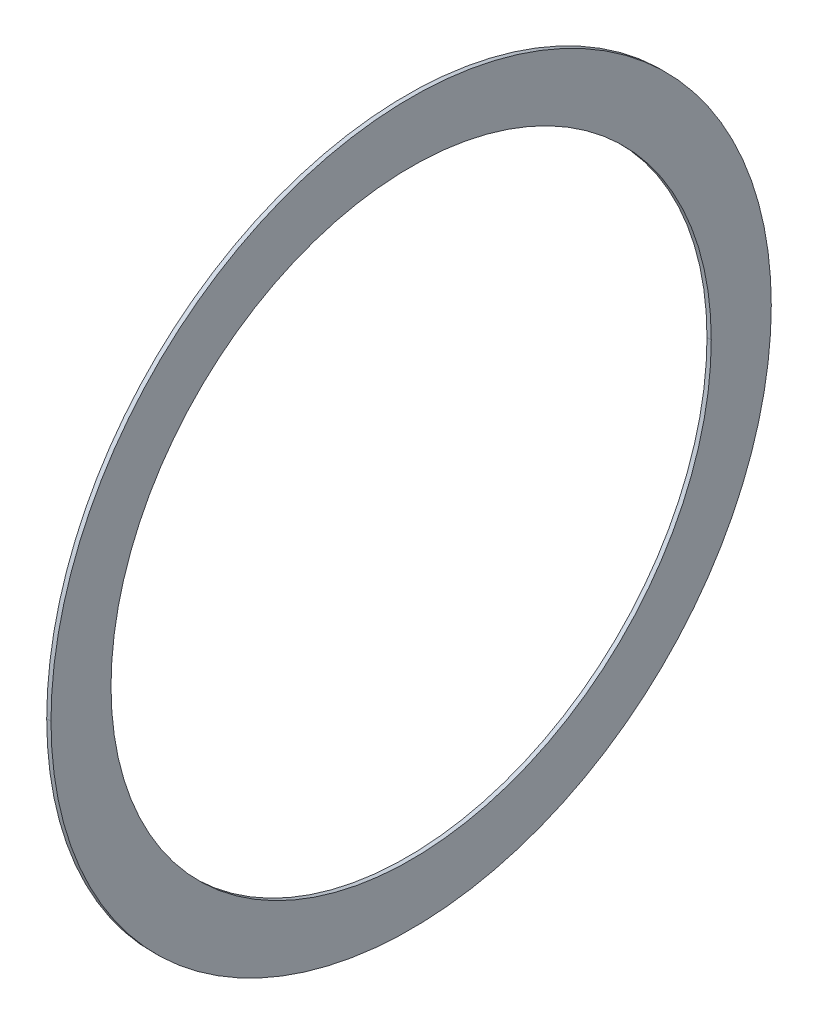
ISO-10303-21;
HEADER;
FILE_DESCRIPTION(('STEP AP214'),'2;1');
FILE_NAME('part.step','',(''),(''),'','','');
FILE_SCHEMA(('AUTOMOTIVE_DESIGN { 1 0 10303 214 1 1 1 1 }'));
ENDSEC;
DATA;
#1=APPLICATION_CONTEXT('core data for automotive mechanical design processes');
#2=APPLICATION_PROTOCOL_DEFINITION('international standard','automotive_design',2000,#1);
#3=PRODUCT_CONTEXT('',#1,'mechanical');
#4=PRODUCT('Part','Part','',(#3));
#5=PRODUCT_RELATED_PRODUCT_CATEGORY('part','',(#4));
#6=PRODUCT_DEFINITION_FORMATION('','',#4);
#7=PRODUCT_DEFINITION_CONTEXT('part definition',#1,'design');
#8=PRODUCT_DEFINITION('design','',#6,#7);
#9=PRODUCT_DEFINITION_SHAPE('','',#8);
#10=(LENGTH_UNIT() NAMED_UNIT(*) SI_UNIT(.MILLI.,.METRE.));
#11=(NAMED_UNIT(*) PLANE_ANGLE_UNIT() SI_UNIT($,.RADIAN.));
#12=(NAMED_UNIT(*) SI_UNIT($,.STERADIAN.) SOLID_ANGLE_UNIT());
#13=UNCERTAINTY_MEASURE_WITH_UNIT(LENGTH_MEASURE(1.E-05),#10,'distance_accuracy_value','');
#14=(GEOMETRIC_REPRESENTATION_CONTEXT(3) GLOBAL_UNCERTAINTY_ASSIGNED_CONTEXT((#13)) GLOBAL_UNIT_ASSIGNED_CONTEXT((#10,
#11,#12)) REPRESENTATION_CONTEXT('',''));
#15=CARTESIAN_POINT('',(0.,0.,0.));
#16=DIRECTION('',(0.,0.,1.));
#17=DIRECTION('',(1.,0.,0.));
#18=AXIS2_PLACEMENT_3D('',#15,#16,#17);
#19=CARTESIAN_POINT('',(0.,46.5,0.));
#20=DIRECTION('',(-1.,0.,0.));
#21=DIRECTION('',(0.,0.,1.));
#22=AXIS2_PLACEMENT_3D('',#19,#20,#21);
#23=PLANE('',#22);
#24=CARTESIAN_POINT('',(0.,0.,0.));
#25=DIRECTION('',(1.,0.,0.));
#26=DIRECTION('',(0.,0.,-1.));
#27=AXIS2_PLACEMENT_3D('',#24,#25,#26);
#28=CIRCLE('',#27,38.75);
#29=CARTESIAN_POINT('',(0.,0.,-38.75));
#30=VERTEX_POINT('',#29);
#31=CARTESIAN_POINT('',(0.,0.,38.75));
#32=VERTEX_POINT('',#31);
#33=EDGE_CURVE('E11',#30,#32,#28,.T.);
#34=ORIENTED_EDGE('',*,*,#33,.T.);
#35=CARTESIAN_POINT('',(0.,0.,0.));
#36=DIRECTION('',(1.,0.,0.));
#37=DIRECTION('',(0.,0.,-1.));
#38=AXIS2_PLACEMENT_3D('',#35,#36,#37);
#39=CIRCLE('',#38,38.75);
#40=EDGE_CURVE('E25',#32,#30,#39,.T.);
#41=ORIENTED_EDGE('',*,*,#40,.T.);
#42=EDGE_LOOP('',(#34,#41));
#43=FACE_BOUND('',#42,.T.);
#44=CARTESIAN_POINT('',(0.,0.,0.));
#45=DIRECTION('',(1.,0.,0.));
#46=DIRECTION('',(0.,0.,-1.));
#47=AXIS2_PLACEMENT_3D('',#44,#45,#46);
#48=CIRCLE('',#47,46.5);
#49=CARTESIAN_POINT('',(0.,0.,46.5));
#50=VERTEX_POINT('',#49);
#51=CARTESIAN_POINT('',(0.,0.,-46.5));
#52=VERTEX_POINT('',#51);
#53=EDGE_CURVE('E95',#50,#52,#48,.T.);
#54=ORIENTED_EDGE('',*,*,#53,.F.);
#55=CARTESIAN_POINT('',(0.,0.,0.));
#56=DIRECTION('',(1.,0.,0.));
#57=DIRECTION('',(0.,0.,-1.));
#58=AXIS2_PLACEMENT_3D('',#55,#56,#57);
#59=CIRCLE('',#58,46.5);
#60=EDGE_CURVE('E90',#52,#50,#59,.T.);
#61=ORIENTED_EDGE('',*,*,#60,.F.);
#62=EDGE_LOOP('',(#54,#61));
#63=FACE_BOUND('',#62,.T.);
#64=ADVANCED_FACE('F17',(#43,#63),#23,.T.);
#65=CARTESIAN_POINT('',(0.552,0.,0.));
#66=DIRECTION('',(1.,0.,0.));
#67=DIRECTION('',(0.,-1.,0.));
#68=AXIS2_PLACEMENT_3D('',#65,#66,#67);
#69=CYLINDRICAL_SURFACE('',#68,46.5);
#70=DIRECTION('',(1.,0.,0.));
#71=VECTOR('',#70,1.);
#72=CARTESIAN_POINT('',(0.,0.,46.5));
#73=LINE('',#72,#71);
#74=CARTESIAN_POINT('',(0.552,0.,46.5));
#75=VERTEX_POINT('',#74);
#76=EDGE_CURVE('E86',#50,#75,#73,.T.);
#77=ORIENTED_EDGE('',*,*,#76,.T.);
#78=CARTESIAN_POINT('',(0.552,0.,0.));
#79=DIRECTION('',(1.,0.,0.));
#80=DIRECTION('',(0.,0.,-1.));
#81=AXIS2_PLACEMENT_3D('',#78,#79,#80);
#82=CIRCLE('',#81,46.5);
#83=CARTESIAN_POINT('',(0.552,0.,-46.5));
#84=VERTEX_POINT('',#83);
#85=EDGE_CURVE('E81',#84,#75,#82,.T.);
#86=ORIENTED_EDGE('',*,*,#85,.F.);
#87=DIRECTION('',(1.,0.,0.));
#88=VECTOR('',#87,1.);
#89=CARTESIAN_POINT('',(0.,0.,-46.5));
#90=LINE('',#89,#88);
#91=EDGE_CURVE('E70',#52,#84,#90,.T.);
#92=ORIENTED_EDGE('',*,*,#91,.F.);
#93=ORIENTED_EDGE('',*,*,#60,.T.);
#94=EDGE_LOOP('',(#77,#86,#92,#93));
#95=FACE_BOUND('',#94,.T.);
#96=ADVANCED_FACE('F111',(#95),#69,.T.);
#97=CARTESIAN_POINT('',(0.552,0.,0.));
#98=DIRECTION('',(1.,0.,0.));
#99=DIRECTION('',(0.,1.,0.));
#100=AXIS2_PLACEMENT_3D('',#97,#98,#99);
#101=CYLINDRICAL_SURFACE('',#100,46.5);
#102=ORIENTED_EDGE('',*,*,#76,.F.);
#103=ORIENTED_EDGE('',*,*,#53,.T.);
#104=ORIENTED_EDGE('',*,*,#91,.T.);
#105=CARTESIAN_POINT('',(0.552,0.,0.));
#106=DIRECTION('',(1.,0.,0.));
#107=DIRECTION('',(0.,0.,-1.));
#108=AXIS2_PLACEMENT_3D('',#105,#106,#107);
#109=CIRCLE('',#108,46.5);
#110=EDGE_CURVE('E67',#75,#84,#109,.T.);
#111=ORIENTED_EDGE('',*,*,#110,.F.);
#112=EDGE_LOOP('',(#102,#103,#104,#111));
#113=FACE_BOUND('',#112,.T.);
#114=ADVANCED_FACE('F106',(#113),#101,.T.);
#115=CARTESIAN_POINT('',(0.552,38.75,0.));
#116=DIRECTION('',(1.,0.,0.));
#117=DIRECTION('',(0.,0.,-1.));
#118=AXIS2_PLACEMENT_3D('',#115,#116,#117);
#119=PLANE('',#118);
#120=ORIENTED_EDGE('',*,*,#85,.T.);
#121=ORIENTED_EDGE('',*,*,#110,.T.);
#122=EDGE_LOOP('',(#120,#121));
#123=FACE_BOUND('',#122,.T.);
#124=CARTESIAN_POINT('',(0.552,0.,0.));
#125=DIRECTION('',(1.,0.,0.));
#126=DIRECTION('',(0.,0.,-1.));
#127=AXIS2_PLACEMENT_3D('',#124,#125,#126);
#128=CIRCLE('',#127,38.75);
#129=CARTESIAN_POINT('',(0.552,0.,38.75));
#130=VERTEX_POINT('',#129);
#131=CARTESIAN_POINT('',(0.552,0.,-38.75));
#132=VERTEX_POINT('',#131);
#133=EDGE_CURVE('E55',#130,#132,#128,.T.);
#134=ORIENTED_EDGE('',*,*,#133,.F.);
#135=CARTESIAN_POINT('',(0.552,0.,0.));
#136=DIRECTION('',(1.,0.,0.));
#137=DIRECTION('',(0.,0.,-1.));
#138=AXIS2_PLACEMENT_3D('',#135,#136,#137);
#139=CIRCLE('',#138,38.75);
#140=EDGE_CURVE('E51',#132,#130,#139,.T.);
#141=ORIENTED_EDGE('',*,*,#140,.F.);
#142=EDGE_LOOP('',(#134,#141));
#143=FACE_BOUND('',#142,.T.);
#144=ADVANCED_FACE('F53',(#123,#143),#119,.T.);
#145=CARTESIAN_POINT('',(0.552,0.,0.));
#146=DIRECTION('',(1.,0.,0.));
#147=DIRECTION('',(0.,-1.,0.));
#148=AXIS2_PLACEMENT_3D('',#145,#146,#147);
#149=CYLINDRICAL_SURFACE('',#148,38.75);
#150=DIRECTION('',(1.,0.,0.));
#151=VECTOR('',#150,1.);
#152=CARTESIAN_POINT('',(0.,0.,38.75));
#153=LINE('',#152,#151);
#154=EDGE_CURVE('E59',#32,#130,#153,.T.);
#155=ORIENTED_EDGE('',*,*,#154,.F.);
#156=ORIENTED_EDGE('',*,*,#33,.F.);
#157=DIRECTION('',(1.,0.,0.));
#158=VECTOR('',#157,1.);
#159=CARTESIAN_POINT('',(0.,0.,-38.75));
#160=LINE('',#159,#158);
#161=EDGE_CURVE('E62',#30,#132,#160,.T.);
#162=ORIENTED_EDGE('',*,*,#161,.T.);
#163=ORIENTED_EDGE('',*,*,#140,.T.);
#164=EDGE_LOOP('',(#155,#156,#162,#163));
#165=FACE_BOUND('',#164,.T.);
#166=ADVANCED_FACE('F63',(#165),#149,.F.);
#167=CARTESIAN_POINT('',(0.552,0.,0.));
#168=DIRECTION('',(1.,0.,0.));
#169=DIRECTION('',(0.,1.,0.));
#170=AXIS2_PLACEMENT_3D('',#167,#168,#169);
#171=CYLINDRICAL_SURFACE('',#170,38.75);
#172=ORIENTED_EDGE('',*,*,#154,.T.);
#173=ORIENTED_EDGE('',*,*,#133,.T.);
#174=ORIENTED_EDGE('',*,*,#161,.F.);
#175=ORIENTED_EDGE('',*,*,#40,.F.);
#176=EDGE_LOOP('',(#172,#173,#174,#175));
#177=FACE_BOUND('',#176,.T.);
#178=ADVANCED_FACE('F66',(#177),#171,.F.);
#179=CLOSED_SHELL('',(#64,#96,#114,#144,#166,#178));
#180=MANIFOLD_SOLID_BREP('B1',#179);
#181=ADVANCED_BREP_SHAPE_REPRESENTATION('',(#18,#180),#14);
#182=SHAPE_DEFINITION_REPRESENTATION(#9,#181);
ENDSEC;
END-ISO-10303-21;
